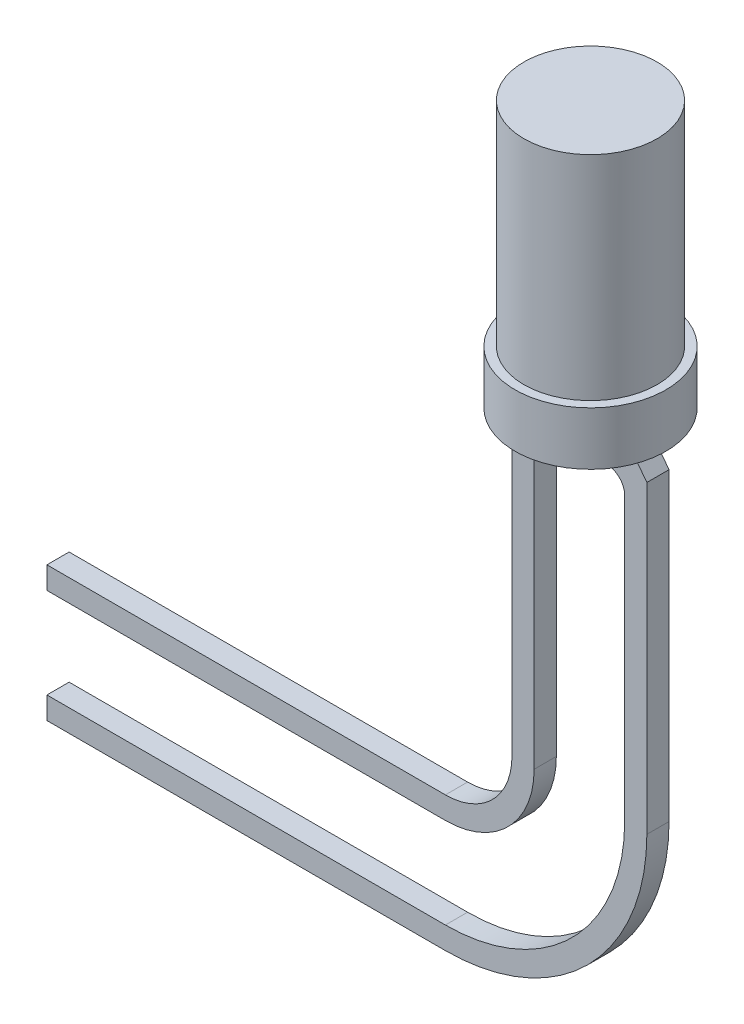
ISO-10303-21;
HEADER;
FILE_DESCRIPTION(('STEP AP214'),'2;1');
FILE_NAME('part.step','',(''),(''),'','','');
FILE_SCHEMA(('AUTOMOTIVE_DESIGN { 1 0 10303 214 1 1 1 1 }'));
ENDSEC;
DATA;
#1=APPLICATION_CONTEXT('core data for automotive mechanical design processes');
#2=APPLICATION_PROTOCOL_DEFINITION('international standard','automotive_design',2000,#1);
#3=PRODUCT_CONTEXT('',#1,'mechanical');
#4=PRODUCT('Part','Part','',(#3));
#5=PRODUCT_RELATED_PRODUCT_CATEGORY('part','',(#4));
#6=PRODUCT_DEFINITION_FORMATION('','',#4);
#7=PRODUCT_DEFINITION_CONTEXT('part definition',#1,'design');
#8=PRODUCT_DEFINITION('design','',#6,#7);
#9=PRODUCT_DEFINITION_SHAPE('','',#8);
#10=(LENGTH_UNIT() NAMED_UNIT(*) SI_UNIT(.MILLI.,.METRE.));
#11=(NAMED_UNIT(*) PLANE_ANGLE_UNIT() SI_UNIT($,.RADIAN.));
#12=(NAMED_UNIT(*) SI_UNIT($,.STERADIAN.) SOLID_ANGLE_UNIT());
#13=UNCERTAINTY_MEASURE_WITH_UNIT(LENGTH_MEASURE(1.E-05),#10,'distance_accuracy_value','');
#14=(GEOMETRIC_REPRESENTATION_CONTEXT(3) GLOBAL_UNCERTAINTY_ASSIGNED_CONTEXT((#13)) GLOBAL_UNIT_ASSIGNED_CONTEXT((#10,
#11,#12)) REPRESENTATION_CONTEXT('',''));
#15=CARTESIAN_POINT('',(0.,0.,0.));
#16=DIRECTION('',(0.,0.,1.));
#17=DIRECTION('',(1.,0.,0.));
#18=AXIS2_PLACEMENT_3D('',#15,#16,#17);
#19=CARTESIAN_POINT('',(0.,-6.,0.));
#20=DIRECTION('',(0.,-1.,0.));
#21=DIRECTION('',(0.,0.,-1.));
#22=AXIS2_PLACEMENT_3D('',#19,#20,#21);
#23=PLANE('',#22);
#24=CARTESIAN_POINT('',(0.,-6.,0.));
#25=DIRECTION('',(0.,-1.,0.));
#26=DIRECTION('',(0.,0.,-1.));
#27=AXIS2_PLACEMENT_3D('',#24,#25,#26);
#28=CIRCLE('',#27,1.7);
#29=CARTESIAN_POINT('',(0.,-6.,-1.7));
#30=VERTEX_POINT('',#29);
#31=EDGE_CURVE('E392',#30,#30,#28,.T.);
#32=ORIENTED_EDGE('',*,*,#31,.T.);
#33=EDGE_LOOP('',(#32));
#34=FACE_BOUND('',#33,.T.);
#35=DIRECTION('',(-1.,0.,0.));
#36=VECTOR('',#35,1.);
#37=CARTESIAN_POINT('',(1.08406668238665,-6.,-0.25));
#38=LINE('',#37,#36);
#39=CARTESIAN_POINT('',(1.08406668238665,-6.,-0.25));
#40=VERTEX_POINT('',#39);
#41=CARTESIAN_POINT('',(0.5,-6.,-0.25));
#42=VERTEX_POINT('',#41);
#43=EDGE_CURVE('E329',#40,#42,#38,.T.);
#44=ORIENTED_EDGE('',*,*,#43,.T.);
#45=DIRECTION('',(0.,0.,1.));
#46=VECTOR('',#45,1.);
#47=CARTESIAN_POINT('',(0.5,-6.,-0.25));
#48=LINE('',#47,#46);
#49=CARTESIAN_POINT('',(0.5,-6.,0.25));
#50=VERTEX_POINT('',#49);
#51=EDGE_CURVE('E365',#42,#50,#48,.T.);
#52=ORIENTED_EDGE('',*,*,#51,.T.);
#53=DIRECTION('',(-1.,0.,0.));
#54=VECTOR('',#53,1.);
#55=CARTESIAN_POINT('',(1.08406668238665,-6.,0.25));
#56=LINE('',#55,#54);
#57=CARTESIAN_POINT('',(1.08406668238665,-6.,0.25));
#58=VERTEX_POINT('',#57);
#59=EDGE_CURVE('E276',#58,#50,#56,.T.);
#60=ORIENTED_EDGE('',*,*,#59,.F.);
#61=DIRECTION('',(0.,0.,1.));
#62=VECTOR('',#61,1.);
#63=CARTESIAN_POINT('',(1.08406668238665,-6.,-0.25));
#64=LINE('',#63,#62);
#65=EDGE_CURVE('E366',#40,#58,#64,.T.);
#66=ORIENTED_EDGE('',*,*,#65,.F.);
#67=EDGE_LOOP('',(#44,#52,#60,#66));
#68=FACE_BOUND('',#67,.T.);
#69=DIRECTION('',(0.,0.,1.));
#70=VECTOR('',#69,1.);
#71=CARTESIAN_POINT('',(-0.5,-6.,-0.25));
#72=LINE('',#71,#70);
#73=CARTESIAN_POINT('',(-0.5,-6.,-0.25));
#74=VERTEX_POINT('',#73);
#75=CARTESIAN_POINT('',(-0.5,-6.,0.25));
#76=VERTEX_POINT('',#75);
#77=EDGE_CURVE('E52',#74,#76,#72,.T.);
#78=ORIENTED_EDGE('',*,*,#77,.F.);
#79=DIRECTION('',(-1.,0.,0.));
#80=VECTOR('',#79,1.);
#81=CARTESIAN_POINT('',(-1.08406668238665,-6.,-0.25));
#82=LINE('',#81,#80);
#83=CARTESIAN_POINT('',(-1.08406668238665,-6.,-0.25));
#84=VERTEX_POINT('',#83);
#85=EDGE_CURVE('E47',#74,#84,#82,.T.);
#86=ORIENTED_EDGE('',*,*,#85,.T.);
#87=DIRECTION('',(0.,0.,1.));
#88=VECTOR('',#87,1.);
#89=CARTESIAN_POINT('',(-1.08406668238665,-6.,-0.25));
#90=LINE('',#89,#88);
#91=CARTESIAN_POINT('',(-1.08406668238665,-6.,0.25));
#92=VERTEX_POINT('',#91);
#93=EDGE_CURVE('E291',#84,#92,#90,.T.);
#94=ORIENTED_EDGE('',*,*,#93,.T.);
#95=DIRECTION('',(-1.,0.,0.));
#96=VECTOR('',#95,1.);
#97=CARTESIAN_POINT('',(-1.08406668238665,-6.,0.25));
#98=LINE('',#97,#96);
#99=EDGE_CURVE('E220',#76,#92,#98,.T.);
#100=ORIENTED_EDGE('',*,*,#99,.F.);
#101=EDGE_LOOP('',(#78,#86,#94,#100));
#102=FACE_BOUND('',#101,.T.);
#103=ADVANCED_FACE('F32',(#34,#68,#102),#23,.T.);
#104=CARTESIAN_POINT('',(0.,-4.8,0.));
#105=DIRECTION('',(0.,1.,0.));
#106=DIRECTION('',(0.,0.,1.));
#107=AXIS2_PLACEMENT_3D('',#104,#105,#106);
#108=CYLINDRICAL_SURFACE('',#107,1.5);
#109=CARTESIAN_POINT('',(0.,-4.8,0.));
#110=DIRECTION('',(0.,-1.,0.));
#111=DIRECTION('',(0.,0.,-1.));
#112=AXIS2_PLACEMENT_3D('',#109,#110,#111);
#113=CIRCLE('',#112,1.5);
#114=CARTESIAN_POINT('',(0.,-4.8,-1.5));
#115=VERTEX_POINT('',#114);
#116=EDGE_CURVE('E40',#115,#115,#113,.F.);
#117=ORIENTED_EDGE('',*,*,#116,.T.);
#118=EDGE_LOOP('',(#117));
#119=FACE_BOUND('',#118,.T.);
#120=CARTESIAN_POINT('',(0.,0.,0.));
#121=DIRECTION('',(0.,1.,0.));
#122=DIRECTION('',(0.,0.,1.));
#123=AXIS2_PLACEMENT_3D('',#120,#121,#122);
#124=CIRCLE('',#123,1.5);
#125=CARTESIAN_POINT('',(0.,0.,1.5));
#126=VERTEX_POINT('',#125);
#127=EDGE_CURVE('E11',#126,#126,#124,.T.);
#128=ORIENTED_EDGE('',*,*,#127,.F.);
#129=EDGE_LOOP('',(#128));
#130=FACE_BOUND('',#129,.T.);
#131=ADVANCED_FACE('F34',(#119,#130),#108,.T.);
#132=CARTESIAN_POINT('',(0.,0.,0.));
#133=DIRECTION('',(0.,1.,0.));
#134=DIRECTION('',(0.,0.,1.));
#135=AXIS2_PLACEMENT_3D('',#132,#133,#134);
#136=PLANE('',#135);
#137=ORIENTED_EDGE('',*,*,#127,.T.);
#138=EDGE_LOOP('',(#137));
#139=FACE_BOUND('',#138,.T.);
#140=ADVANCED_FACE('F410',(#139),#136,.T.);
#141=CARTESIAN_POINT('',(0.,-6.,0.));
#142=DIRECTION('',(0.,1.,0.));
#143=DIRECTION('',(0.,0.,1.));
#144=AXIS2_PLACEMENT_3D('',#141,#142,#143);
#145=CYLINDRICAL_SURFACE('',#144,1.7);
#146=ORIENTED_EDGE('',*,*,#31,.F.);
#147=EDGE_LOOP('',(#146));
#148=FACE_BOUND('',#147,.T.);
#149=CARTESIAN_POINT('',(0.,-4.8,0.));
#150=DIRECTION('',(0.,-1.,0.));
#151=DIRECTION('',(0.,0.,-1.));
#152=AXIS2_PLACEMENT_3D('',#149,#150,#151);
#153=CIRCLE('',#152,1.7);
#154=CARTESIAN_POINT('',(0.,-4.8,-1.7));
#155=VERTEX_POINT('',#154);
#156=EDGE_CURVE('E369',#155,#155,#153,.T.);
#157=ORIENTED_EDGE('',*,*,#156,.T.);
#158=EDGE_LOOP('',(#157));
#159=FACE_BOUND('',#158,.T.);
#160=ADVANCED_FACE('F405',(#148,#159),#145,.T.);
#161=CARTESIAN_POINT('',(0.,-4.8,0.));
#162=DIRECTION('',(0.,-1.,0.));
#163=DIRECTION('',(0.,0.,-1.));
#164=AXIS2_PLACEMENT_3D('',#161,#162,#163);
#165=PLANE('',#164);
#166=ORIENTED_EDGE('',*,*,#116,.F.);
#167=EDGE_LOOP('',(#166));
#168=FACE_BOUND('',#167,.T.);
#169=ORIENTED_EDGE('',*,*,#156,.F.);
#170=EDGE_LOOP('',(#169));
#171=FACE_BOUND('',#170,.T.);
#172=ADVANCED_FACE('F401',(#168,#171),#165,.F.);
#173=CARTESIAN_POINT('',(1.52,-6.57249783833724,-0.25));
#174=DIRECTION('',(0.795602863014056,0.60581852428251,0.));
#175=DIRECTION('',(-0.60581852428251,0.795602863014056,0.));
#176=AXIS2_PLACEMENT_3D('',#173,#174,#175);
#177=PLANE('',#176);
#178=ORIENTED_EDGE('',*,*,#65,.T.);
#179=DIRECTION('',(-0.60581852428251,0.795602863014055,0.));
#180=VECTOR('',#179,1.);
#181=CARTESIAN_POINT('',(1.52,-6.57249783833724,0.25));
#182=LINE('',#181,#180);
#183=CARTESIAN_POINT('',(1.52,-6.57249783833724,0.25));
#184=VERTEX_POINT('',#183);
#185=EDGE_CURVE('E327',#184,#58,#182,.T.);
#186=ORIENTED_EDGE('',*,*,#185,.F.);
#187=DIRECTION('',(0.,0.,1.));
#188=VECTOR('',#187,1.);
#189=CARTESIAN_POINT('',(1.52,-6.57249783833724,-0.25));
#190=LINE('',#189,#188);
#191=CARTESIAN_POINT('',(1.52,-6.57249783833724,-0.25));
#192=VERTEX_POINT('',#191);
#193=EDGE_CURVE('E370',#192,#184,#190,.T.);
#194=ORIENTED_EDGE('',*,*,#193,.F.);
#195=DIRECTION('',(-0.60581852428251,0.795602863014055,0.));
#196=VECTOR('',#195,1.);
#197=CARTESIAN_POINT('',(1.52,-6.57249783833724,-0.25));
#198=LINE('',#197,#196);
#199=EDGE_CURVE('E362',#192,#40,#198,.T.);
#200=ORIENTED_EDGE('',*,*,#199,.T.);
#201=EDGE_LOOP('',(#178,#186,#194,#200));
#202=FACE_BOUND('',#201,.T.);
#203=ADVANCED_FACE('F404',(#202),#177,.T.);
#204=CARTESIAN_POINT('',(1.52,-13.4396370979597,-0.25));
#205=DIRECTION('',(1.,0.,0.));
#206=DIRECTION('',(0.,1.,0.));
#207=AXIS2_PLACEMENT_3D('',#204,#205,#206);
#208=PLANE('',#207);
#209=ORIENTED_EDGE('',*,*,#193,.T.);
#210=DIRECTION('',(0.,1.,0.));
#211=VECTOR('',#210,1.);
#212=CARTESIAN_POINT('',(1.52,-13.4396370979597,0.25));
#213=LINE('',#212,#211);
#214=CARTESIAN_POINT('',(1.52,-13.4396370979597,0.25));
#215=VERTEX_POINT('',#214);
#216=EDGE_CURVE('E324',#215,#184,#213,.T.);
#217=ORIENTED_EDGE('',*,*,#216,.F.);
#218=DIRECTION('',(0.,0.,1.));
#219=VECTOR('',#218,1.);
#220=CARTESIAN_POINT('',(1.52,-13.4396370979597,-0.25));
#221=LINE('',#220,#219);
#222=CARTESIAN_POINT('',(1.52,-13.4396370979597,-0.25));
#223=VERTEX_POINT('',#222);
#224=EDGE_CURVE('E372',#223,#215,#221,.T.);
#225=ORIENTED_EDGE('',*,*,#224,.F.);
#226=DIRECTION('',(0.,1.,0.));
#227=VECTOR('',#226,1.);
#228=CARTESIAN_POINT('',(1.52,-13.4396370979597,-0.25));
#229=LINE('',#228,#227);
#230=EDGE_CURVE('E359',#223,#192,#229,.T.);
#231=ORIENTED_EDGE('',*,*,#230,.T.);
#232=EDGE_LOOP('',(#209,#217,#225,#231));
#233=FACE_BOUND('',#232,.T.);
#234=ADVANCED_FACE('F462',(#233),#208,.T.);
#235=CARTESIAN_POINT('',(-3.02,-13.4396370979597,-0.25));
#236=DIRECTION('',(0.,0.,1.));
#237=DIRECTION('',(1.,0.,0.));
#238=AXIS2_PLACEMENT_3D('',#235,#236,#237);
#239=CYLINDRICAL_SURFACE('',#238,4.54);
#240=ORIENTED_EDGE('',*,*,#224,.T.);
#241=CARTESIAN_POINT('',(-3.02,-13.4396370979597,0.25));
#242=DIRECTION('',(0.,0.,1.));
#243=DIRECTION('',(-1.,0.,0.));
#244=AXIS2_PLACEMENT_3D('',#241,#242,#243);
#245=CIRCLE('',#244,4.54);
#246=CARTESIAN_POINT('',(-3.02,-17.9796370979597,0.25));
#247=VERTEX_POINT('',#246);
#248=EDGE_CURVE('E321',#247,#215,#245,.T.);
#249=ORIENTED_EDGE('',*,*,#248,.F.);
#250=DIRECTION('',(0.,0.,1.));
#251=VECTOR('',#250,1.);
#252=CARTESIAN_POINT('',(-3.02,-17.9796370979597,-0.25));
#253=LINE('',#252,#251);
#254=CARTESIAN_POINT('',(-3.02,-17.9796370979597,-0.25));
#255=VERTEX_POINT('',#254);
#256=EDGE_CURVE('E374',#255,#247,#253,.T.);
#257=ORIENTED_EDGE('',*,*,#256,.F.);
#258=CARTESIAN_POINT('',(-3.02,-13.4396370979597,-0.25));
#259=DIRECTION('',(0.,0.,1.));
#260=DIRECTION('',(-1.,0.,0.));
#261=AXIS2_PLACEMENT_3D('',#258,#259,#260);
#262=CIRCLE('',#261,4.54);
#263=EDGE_CURVE('E356',#255,#223,#262,.T.);
#264=ORIENTED_EDGE('',*,*,#263,.T.);
#265=EDGE_LOOP('',(#240,#249,#257,#264));
#266=FACE_BOUND('',#265,.T.);
#267=ADVANCED_FACE('F458',(#266),#239,.T.);
#268=CARTESIAN_POINT('',(-3.02,-17.9796370979597,-0.25));
#269=DIRECTION('',(0.,-1.,0.));
#270=DIRECTION('',(0.,0.,-1.));
#271=AXIS2_PLACEMENT_3D('',#268,#269,#270);
#272=PLANE('',#271);
#273=ORIENTED_EDGE('',*,*,#256,.T.);
#274=DIRECTION('',(1.,0.,0.));
#275=VECTOR('',#274,1.);
#276=CARTESIAN_POINT('',(-3.02,-17.9796370979597,0.25));
#277=LINE('',#276,#275);
#278=CARTESIAN_POINT('',(-12.,-17.9796370979597,0.25));
#279=VERTEX_POINT('',#278);
#280=EDGE_CURVE('E318',#279,#247,#277,.T.);
#281=ORIENTED_EDGE('',*,*,#280,.F.);
#282=DIRECTION('',(0.,0.,1.));
#283=VECTOR('',#282,1.);
#284=CARTESIAN_POINT('',(-12.,-17.9796370979597,-0.25));
#285=LINE('',#284,#283);
#286=CARTESIAN_POINT('',(-12.,-17.9796370979597,-0.25));
#287=VERTEX_POINT('',#286);
#288=EDGE_CURVE('E376',#287,#279,#285,.T.);
#289=ORIENTED_EDGE('',*,*,#288,.F.);
#290=DIRECTION('',(1.,0.,0.));
#291=VECTOR('',#290,1.);
#292=CARTESIAN_POINT('',(-3.02,-17.9796370979597,-0.25));
#293=LINE('',#292,#291);
#294=EDGE_CURVE('E353',#287,#255,#293,.T.);
#295=ORIENTED_EDGE('',*,*,#294,.T.);
#296=EDGE_LOOP('',(#273,#281,#289,#295));
#297=FACE_BOUND('',#296,.T.);
#298=ADVANCED_FACE('F454',(#297),#272,.T.);
#299=CARTESIAN_POINT('',(-12.,-17.9796370979597,-0.25));
#300=DIRECTION('',(-1.,0.,0.));
#301=DIRECTION('',(0.,0.,1.));
#302=AXIS2_PLACEMENT_3D('',#299,#300,#301);
#303=PLANE('',#302);
#304=ORIENTED_EDGE('',*,*,#288,.T.);
#305=DIRECTION('',(0.,-1.,0.));
#306=VECTOR('',#305,1.);
#307=CARTESIAN_POINT('',(-12.,-17.9796370979597,0.25));
#308=LINE('',#307,#306);
#309=CARTESIAN_POINT('',(-12.,-17.4796370979597,0.25));
#310=VERTEX_POINT('',#309);
#311=EDGE_CURVE('E315',#310,#279,#308,.T.);
#312=ORIENTED_EDGE('',*,*,#311,.F.);
#313=DIRECTION('',(0.,0.,1.));
#314=VECTOR('',#313,1.);
#315=CARTESIAN_POINT('',(-12.,-17.4796370979597,-0.25));
#316=LINE('',#315,#314);
#317=CARTESIAN_POINT('',(-12.,-17.4796370979597,-0.25));
#318=VERTEX_POINT('',#317);
#319=EDGE_CURVE('E378',#318,#310,#316,.T.);
#320=ORIENTED_EDGE('',*,*,#319,.F.);
#321=DIRECTION('',(0.,-1.,0.));
#322=VECTOR('',#321,1.);
#323=CARTESIAN_POINT('',(-12.,-17.9796370979597,-0.25));
#324=LINE('',#323,#322);
#325=EDGE_CURVE('E350',#318,#287,#324,.T.);
#326=ORIENTED_EDGE('',*,*,#325,.T.);
#327=EDGE_LOOP('',(#304,#312,#320,#326));
#328=FACE_BOUND('',#327,.T.);
#329=ADVANCED_FACE('F450',(#328),#303,.T.);
#330=CARTESIAN_POINT('',(-12.,-17.4796370979597,-0.25));
#331=DIRECTION('',(0.,1.,0.));
#332=DIRECTION('',(0.,0.,1.));
#333=AXIS2_PLACEMENT_3D('',#330,#331,#332);
#334=PLANE('',#333);
#335=ORIENTED_EDGE('',*,*,#319,.T.);
#336=DIRECTION('',(-1.,0.,0.));
#337=VECTOR('',#336,1.);
#338=CARTESIAN_POINT('',(-12.,-17.4796370979597,0.25));
#339=LINE('',#338,#337);
#340=CARTESIAN_POINT('',(-3.02,-17.4796370979597,0.25));
#341=VERTEX_POINT('',#340);
#342=EDGE_CURVE('E312',#341,#310,#339,.T.);
#343=ORIENTED_EDGE('',*,*,#342,.F.);
#344=DIRECTION('',(0.,0.,1.));
#345=VECTOR('',#344,1.);
#346=CARTESIAN_POINT('',(-3.02,-17.4796370979597,-0.25));
#347=LINE('',#346,#345);
#348=CARTESIAN_POINT('',(-3.02,-17.4796370979597,-0.25));
#349=VERTEX_POINT('',#348);
#350=EDGE_CURVE('E380',#349,#341,#347,.T.);
#351=ORIENTED_EDGE('',*,*,#350,.F.);
#352=DIRECTION('',(-1.,0.,0.));
#353=VECTOR('',#352,1.);
#354=CARTESIAN_POINT('',(-12.,-17.4796370979597,-0.25));
#355=LINE('',#354,#353);
#356=EDGE_CURVE('E347',#349,#318,#355,.T.);
#357=ORIENTED_EDGE('',*,*,#356,.T.);
#358=EDGE_LOOP('',(#335,#343,#351,#357));
#359=FACE_BOUND('',#358,.T.);
#360=ADVANCED_FACE('F446',(#359),#334,.T.);
#361=CARTESIAN_POINT('',(-3.02,-13.4396370979597,-0.25));
#362=DIRECTION('',(0.,0.,1.));
#363=DIRECTION('',(1.,0.,0.));
#364=AXIS2_PLACEMENT_3D('',#361,#362,#363);
#365=CYLINDRICAL_SURFACE('',#364,4.04);
#366=ORIENTED_EDGE('',*,*,#350,.T.);
#367=CARTESIAN_POINT('',(-3.02,-13.4396370979597,0.25));
#368=DIRECTION('',(0.,0.,-1.));
#369=DIRECTION('',(-1.,0.,0.));
#370=AXIS2_PLACEMENT_3D('',#367,#368,#369);
#371=CIRCLE('',#370,4.04);
#372=CARTESIAN_POINT('',(1.02,-13.4396370979597,0.25));
#373=VERTEX_POINT('',#372);
#374=EDGE_CURVE('E309',#373,#341,#371,.T.);
#375=ORIENTED_EDGE('',*,*,#374,.F.);
#376=DIRECTION('',(0.,0.,1.));
#377=VECTOR('',#376,1.);
#378=CARTESIAN_POINT('',(1.02,-13.4396370979597,-0.25));
#379=LINE('',#378,#377);
#380=CARTESIAN_POINT('',(1.02,-13.4396370979597,-0.25));
#381=VERTEX_POINT('',#380);
#382=EDGE_CURVE('E382',#381,#373,#379,.T.);
#383=ORIENTED_EDGE('',*,*,#382,.F.);
#384=CARTESIAN_POINT('',(-3.02,-13.4396370979597,-0.25));
#385=DIRECTION('',(0.,0.,-1.));
#386=DIRECTION('',(-1.,0.,0.));
#387=AXIS2_PLACEMENT_3D('',#384,#385,#386);
#388=CIRCLE('',#387,4.04);
#389=EDGE_CURVE('E344',#381,#349,#388,.T.);
#390=ORIENTED_EDGE('',*,*,#389,.T.);
#391=EDGE_LOOP('',(#366,#375,#383,#390));
#392=FACE_BOUND('',#391,.T.);
#393=ADVANCED_FACE('F442',(#392),#365,.F.);
#394=CARTESIAN_POINT('',(1.02,-7.07249783833724,-0.25));
#395=DIRECTION('',(-1.,0.,0.));
#396=DIRECTION('',(0.,0.,1.));
#397=AXIS2_PLACEMENT_3D('',#394,#395,#396);
#398=PLANE('',#397);
#399=ORIENTED_EDGE('',*,*,#382,.T.);
#400=DIRECTION('',(0.,-1.,0.));
#401=VECTOR('',#400,1.);
#402=CARTESIAN_POINT('',(1.02,-7.07249783833724,0.25));
#403=LINE('',#402,#401);
#404=CARTESIAN_POINT('',(1.02,-7.07249783833724,0.25));
#405=VERTEX_POINT('',#404);
#406=EDGE_CURVE('E306',#405,#373,#403,.T.);
#407=ORIENTED_EDGE('',*,*,#406,.F.);
#408=DIRECTION('',(0.,0.,1.));
#409=VECTOR('',#408,1.);
#410=CARTESIAN_POINT('',(1.02,-7.07249783833724,-0.25));
#411=LINE('',#410,#409);
#412=CARTESIAN_POINT('',(1.02,-7.07249783833724,-0.25));
#413=VERTEX_POINT('',#412);
#414=EDGE_CURVE('E384',#413,#405,#411,.T.);
#415=ORIENTED_EDGE('',*,*,#414,.F.);
#416=DIRECTION('',(0.,-1.,0.));
#417=VECTOR('',#416,1.);
#418=CARTESIAN_POINT('',(1.02,-7.07249783833724,-0.25));
#419=LINE('',#418,#417);
#420=EDGE_CURVE('E341',#413,#381,#419,.T.);
#421=ORIENTED_EDGE('',*,*,#420,.T.);
#422=EDGE_LOOP('',(#399,#407,#415,#421));
#423=FACE_BOUND('',#422,.T.);
#424=ADVANCED_FACE('F438',(#423),#398,.T.);
#425=CARTESIAN_POINT('',(0.62,-7.07249783833724,-0.25));
#426=DIRECTION('',(0.,0.,1.));
#427=DIRECTION('',(1.,0.,0.));
#428=AXIS2_PLACEMENT_3D('',#425,#426,#427);
#429=CYLINDRICAL_SURFACE('',#428,0.4);
#430=ORIENTED_EDGE('',*,*,#414,.T.);
#431=CARTESIAN_POINT('',(0.62,-7.07249783833724,0.25));
#432=DIRECTION('',(0.,0.,-1.));
#433=DIRECTION('',(-1.,0.,0.));
#434=AXIS2_PLACEMENT_3D('',#431,#432,#433);
#435=CIRCLE('',#434,0.4);
#436=CARTESIAN_POINT('',(0.62,-6.67249783833724,0.25));
#437=VERTEX_POINT('',#436);
#438=EDGE_CURVE('E303',#437,#405,#435,.T.);
#439=ORIENTED_EDGE('',*,*,#438,.F.);
#440=DIRECTION('',(0.,0.,1.));
#441=VECTOR('',#440,1.);
#442=CARTESIAN_POINT('',(0.62,-6.67249783833724,-0.25));
#443=LINE('',#442,#441);
#444=CARTESIAN_POINT('',(0.62,-6.67249783833724,-0.25));
#445=VERTEX_POINT('',#444);
#446=EDGE_CURVE('E386',#445,#437,#443,.T.);
#447=ORIENTED_EDGE('',*,*,#446,.F.);
#448=CARTESIAN_POINT('',(0.62,-7.07249783833724,-0.25));
#449=DIRECTION('',(0.,0.,-1.));
#450=DIRECTION('',(-1.,0.,0.));
#451=AXIS2_PLACEMENT_3D('',#448,#449,#450);
#452=CIRCLE('',#451,0.4);
#453=EDGE_CURVE('E338',#445,#413,#452,.T.);
#454=ORIENTED_EDGE('',*,*,#453,.T.);
#455=EDGE_LOOP('',(#430,#439,#447,#454));
#456=FACE_BOUND('',#455,.T.);
#457=ADVANCED_FACE('F434',(#456),#429,.F.);
#458=CARTESIAN_POINT('',(0.5,-6.67249783833724,-0.25));
#459=DIRECTION('',(0.,-1.,0.));
#460=DIRECTION('',(0.,0.,-1.));
#461=AXIS2_PLACEMENT_3D('',#458,#459,#460);
#462=PLANE('',#461);
#463=ORIENTED_EDGE('',*,*,#446,.T.);
#464=DIRECTION('',(1.,0.,0.));
#465=VECTOR('',#464,1.);
#466=CARTESIAN_POINT('',(0.5,-6.67249783833724,0.25));
#467=LINE('',#466,#465);
#468=CARTESIAN_POINT('',(0.5,-6.67249783833724,0.25));
#469=VERTEX_POINT('',#468);
#470=EDGE_CURVE('E300',#469,#437,#467,.T.);
#471=ORIENTED_EDGE('',*,*,#470,.F.);
#472=DIRECTION('',(0.,0.,1.));
#473=VECTOR('',#472,1.);
#474=CARTESIAN_POINT('',(0.5,-6.67249783833724,-0.25));
#475=LINE('',#474,#473);
#476=CARTESIAN_POINT('',(0.5,-6.67249783833724,-0.25));
#477=VERTEX_POINT('',#476);
#478=EDGE_CURVE('E388',#477,#469,#475,.T.);
#479=ORIENTED_EDGE('',*,*,#478,.F.);
#480=DIRECTION('',(1.,0.,0.));
#481=VECTOR('',#480,1.);
#482=CARTESIAN_POINT('',(0.5,-6.67249783833724,-0.25));
#483=LINE('',#482,#481);
#484=EDGE_CURVE('E335',#477,#445,#483,.T.);
#485=ORIENTED_EDGE('',*,*,#484,.T.);
#486=EDGE_LOOP('',(#463,#471,#479,#485));
#487=FACE_BOUND('',#486,.T.);
#488=ADVANCED_FACE('F430',(#487),#462,.T.);
#489=CARTESIAN_POINT('',(0.5,-6.,-0.25));
#490=DIRECTION('',(-1.,0.,0.));
#491=DIRECTION('',(0.,-1.,0.));
#492=AXIS2_PLACEMENT_3D('',#489,#490,#491);
#493=PLANE('',#492);
#494=ORIENTED_EDGE('',*,*,#478,.T.);
#495=DIRECTION('',(0.,-1.,0.));
#496=VECTOR('',#495,1.);
#497=CARTESIAN_POINT('',(0.5,-6.,0.25));
#498=LINE('',#497,#496);
#499=EDGE_CURVE('E297',#50,#469,#498,.T.);
#500=ORIENTED_EDGE('',*,*,#499,.F.);
#501=ORIENTED_EDGE('',*,*,#51,.F.);
#502=DIRECTION('',(0.,-1.,0.));
#503=VECTOR('',#502,1.);
#504=CARTESIAN_POINT('',(0.5,-6.,-0.25));
#505=LINE('',#504,#503);
#506=EDGE_CURVE('E332',#42,#477,#505,.T.);
#507=ORIENTED_EDGE('',*,*,#506,.T.);
#508=EDGE_LOOP('',(#494,#500,#501,#507));
#509=FACE_BOUND('',#508,.T.);
#510=ADVANCED_FACE('F426',(#509),#493,.T.);
#511=CARTESIAN_POINT('',(0.62,-7.07249783833724,-0.25));
#512=DIRECTION('',(0.,0.,-1.));
#513=DIRECTION('',(-1.,0.,0.));
#514=AXIS2_PLACEMENT_3D('',#511,#512,#513);
#515=PLANE('',#514);
#516=ORIENTED_EDGE('',*,*,#43,.F.);
#517=ORIENTED_EDGE('',*,*,#199,.F.);
#518=ORIENTED_EDGE('',*,*,#230,.F.);
#519=ORIENTED_EDGE('',*,*,#263,.F.);
#520=ORIENTED_EDGE('',*,*,#294,.F.);
#521=ORIENTED_EDGE('',*,*,#325,.F.);
#522=ORIENTED_EDGE('',*,*,#356,.F.);
#523=ORIENTED_EDGE('',*,*,#389,.F.);
#524=ORIENTED_EDGE('',*,*,#420,.F.);
#525=ORIENTED_EDGE('',*,*,#453,.F.);
#526=ORIENTED_EDGE('',*,*,#484,.F.);
#527=ORIENTED_EDGE('',*,*,#506,.F.);
#528=EDGE_LOOP('',(#516,#517,#518,#519,#520,#521,#522,#523,#524,#525,#526,#527));
#529=FACE_BOUND('',#528,.T.);
#530=ADVANCED_FACE('F429',(#529),#515,.T.);
#531=CARTESIAN_POINT('',(0.62,-7.07249783833724,0.25));
#532=DIRECTION('',(0.,0.,-1.));
#533=DIRECTION('',(-1.,0.,0.));
#534=AXIS2_PLACEMENT_3D('',#531,#532,#533);
#535=PLANE('',#534);
#536=ORIENTED_EDGE('',*,*,#59,.T.);
#537=ORIENTED_EDGE('',*,*,#499,.T.);
#538=ORIENTED_EDGE('',*,*,#470,.T.);
#539=ORIENTED_EDGE('',*,*,#438,.T.);
#540=ORIENTED_EDGE('',*,*,#406,.T.);
#541=ORIENTED_EDGE('',*,*,#374,.T.);
#542=ORIENTED_EDGE('',*,*,#342,.T.);
#543=ORIENTED_EDGE('',*,*,#311,.T.);
#544=ORIENTED_EDGE('',*,*,#280,.T.);
#545=ORIENTED_EDGE('',*,*,#248,.T.);
#546=ORIENTED_EDGE('',*,*,#216,.T.);
#547=ORIENTED_EDGE('',*,*,#185,.T.);
#548=EDGE_LOOP('',(#536,#537,#538,#539,#540,#541,#542,#543,#544,#545,#546,#547));
#549=FACE_BOUND('',#548,.T.);
#550=ADVANCED_FACE('F472',(#549),#535,.F.);
#551=CARTESIAN_POINT('',(-0.62,-7.07249783833724,-0.25));
#552=DIRECTION('',(0.,0.,1.));
#553=DIRECTION('',(1.,0.,0.));
#554=AXIS2_PLACEMENT_3D('',#551,#552,#553);
#555=CYLINDRICAL_SURFACE('',#554,0.4);
#556=DIRECTION('',(0.,0.,1.));
#557=VECTOR('',#556,1.);
#558=CARTESIAN_POINT('',(-0.62,-6.67249783833724,-0.25));
#559=LINE('',#558,#557);
#560=CARTESIAN_POINT('',(-0.62,-6.67249783833724,-0.25));
#561=VERTEX_POINT('',#560);
#562=CARTESIAN_POINT('',(-0.62,-6.67249783833724,0.25));
#563=VERTEX_POINT('',#562);
#564=EDGE_CURVE('E191',#561,#563,#559,.T.);
#565=ORIENTED_EDGE('',*,*,#564,.T.);
#566=CARTESIAN_POINT('',(-0.62,-7.07249783833724,0.25));
#567=DIRECTION('',(0.,0.,-1.));
#568=DIRECTION('',(1.,0.,0.));
#569=AXIS2_PLACEMENT_3D('',#566,#567,#568);
#570=CIRCLE('',#569,0.4);
#571=CARTESIAN_POINT('',(-1.02,-7.07249783833724,0.25));
#572=VERTEX_POINT('',#571);
#573=EDGE_CURVE('E195',#572,#563,#570,.T.);
#574=ORIENTED_EDGE('',*,*,#573,.F.);
#575=DIRECTION('',(0.,0.,1.));
#576=VECTOR('',#575,1.);
#577=CARTESIAN_POINT('',(-1.02,-7.07249783833724,-0.25));
#578=LINE('',#577,#576);
#579=CARTESIAN_POINT('',(-1.02,-7.07249783833724,-0.25));
#580=VERTEX_POINT('',#579);
#581=EDGE_CURVE('E274',#580,#572,#578,.T.);
#582=ORIENTED_EDGE('',*,*,#581,.F.);
#583=CARTESIAN_POINT('',(-0.62,-7.07249783833724,-0.25));
#584=DIRECTION('',(0.,0.,-1.));
#585=DIRECTION('',(1.,0.,0.));
#586=AXIS2_PLACEMENT_3D('',#583,#584,#585);
#587=CIRCLE('',#586,0.4);
#588=EDGE_CURVE('E197',#580,#561,#587,.T.);
#589=ORIENTED_EDGE('',*,*,#588,.T.);
#590=EDGE_LOOP('',(#565,#574,#582,#589));
#591=FACE_BOUND('',#590,.T.);
#592=ADVANCED_FACE('F193',(#591),#555,.F.);
#593=CARTESIAN_POINT('',(-1.02,-7.07249783833724,-0.25));
#594=DIRECTION('',(1.,0.,0.));
#595=DIRECTION('',(0.,0.,-1.));
#596=AXIS2_PLACEMENT_3D('',#593,#594,#595);
#597=PLANE('',#596);
#598=ORIENTED_EDGE('',*,*,#581,.T.);
#599=DIRECTION('',(0.,1.,0.));
#600=VECTOR('',#599,1.);
#601=CARTESIAN_POINT('',(-1.02,-7.07249783833724,0.25));
#602=LINE('',#601,#600);
#603=CARTESIAN_POINT('',(-1.02,-13.4396370979597,0.25));
#604=VERTEX_POINT('',#603);
#605=EDGE_CURVE('E216',#604,#572,#602,.T.);
#606=ORIENTED_EDGE('',*,*,#605,.F.);
#607=DIRECTION('',(0.,0.,1.));
#608=VECTOR('',#607,1.);
#609=CARTESIAN_POINT('',(-1.02,-13.4396370979597,-0.25));
#610=LINE('',#609,#608);
#611=CARTESIAN_POINT('',(-1.02,-13.4396370979597,-0.25));
#612=VERTEX_POINT('',#611);
#613=EDGE_CURVE('E277',#612,#604,#610,.T.);
#614=ORIENTED_EDGE('',*,*,#613,.F.);
#615=DIRECTION('',(0.,1.,0.));
#616=VECTOR('',#615,1.);
#617=CARTESIAN_POINT('',(-1.02,-7.07249783833724,-0.25));
#618=LINE('',#617,#616);
#619=EDGE_CURVE('E202',#612,#580,#618,.T.);
#620=ORIENTED_EDGE('',*,*,#619,.T.);
#621=EDGE_LOOP('',(#598,#606,#614,#620));
#622=FACE_BOUND('',#621,.T.);
#623=ADVANCED_FACE('F479',(#622),#597,.T.);
#624=CARTESIAN_POINT('',(-3.02,-13.4396370979597,-0.25));
#625=DIRECTION('',(0.,0.,1.));
#626=DIRECTION('',(1.,0.,0.));
#627=AXIS2_PLACEMENT_3D('',#624,#625,#626);
#628=CYLINDRICAL_SURFACE('',#627,2.);
#629=ORIENTED_EDGE('',*,*,#613,.T.);
#630=CARTESIAN_POINT('',(-3.02,-13.4396370979597,0.25));
#631=DIRECTION('',(0.,0.,1.));
#632=DIRECTION('',(-1.,0.,0.));
#633=AXIS2_PLACEMENT_3D('',#630,#631,#632);
#634=CIRCLE('',#633,2.);
#635=CARTESIAN_POINT('',(-3.02,-15.4396370979597,0.25));
#636=VERTEX_POINT('',#635);
#637=EDGE_CURVE('E241',#636,#604,#634,.T.);
#638=ORIENTED_EDGE('',*,*,#637,.F.);
#639=DIRECTION('',(0.,0.,1.));
#640=VECTOR('',#639,1.);
#641=CARTESIAN_POINT('',(-3.02,-15.4396370979597,-0.25));
#642=LINE('',#641,#640);
#643=CARTESIAN_POINT('',(-3.02,-15.4396370979597,-0.25));
#644=VERTEX_POINT('',#643);
#645=EDGE_CURVE('E279',#644,#636,#642,.T.);
#646=ORIENTED_EDGE('',*,*,#645,.F.);
#647=CARTESIAN_POINT('',(-3.02,-13.4396370979597,-0.25));
#648=DIRECTION('',(0.,0.,1.));
#649=DIRECTION('',(-1.,0.,0.));
#650=AXIS2_PLACEMENT_3D('',#647,#648,#649);
#651=CIRCLE('',#650,2.);
#652=EDGE_CURVE('E269',#644,#612,#651,.T.);
#653=ORIENTED_EDGE('',*,*,#652,.T.);
#654=EDGE_LOOP('',(#629,#638,#646,#653));
#655=FACE_BOUND('',#654,.T.);
#656=ADVANCED_FACE('F510',(#655),#628,.T.);
#657=CARTESIAN_POINT('',(-3.02,-15.4396370979597,-0.25));
#658=DIRECTION('',(0.,-1.,0.));
#659=DIRECTION('',(1.,0.,0.));
#660=AXIS2_PLACEMENT_3D('',#657,#658,#659);
#661=PLANE('',#660);
#662=ORIENTED_EDGE('',*,*,#645,.T.);
#663=DIRECTION('',(1.,0.,0.));
#664=VECTOR('',#663,1.);
#665=CARTESIAN_POINT('',(-3.02,-15.4396370979597,0.25));
#666=LINE('',#665,#664);
#667=CARTESIAN_POINT('',(-12.,-15.4396370979597,0.25));
#668=VERTEX_POINT('',#667);
#669=EDGE_CURVE('E238',#668,#636,#666,.T.);
#670=ORIENTED_EDGE('',*,*,#669,.F.);
#671=DIRECTION('',(0.,0.,1.));
#672=VECTOR('',#671,1.);
#673=CARTESIAN_POINT('',(-12.,-15.4396370979597,-0.25));
#674=LINE('',#673,#672);
#675=CARTESIAN_POINT('',(-12.,-15.4396370979597,-0.25));
#676=VERTEX_POINT('',#675);
#677=EDGE_CURVE('E281',#676,#668,#674,.T.);
#678=ORIENTED_EDGE('',*,*,#677,.F.);
#679=DIRECTION('',(1.,0.,0.));
#680=VECTOR('',#679,1.);
#681=CARTESIAN_POINT('',(-3.02,-15.4396370979597,-0.25));
#682=LINE('',#681,#680);
#683=EDGE_CURVE('E266',#676,#644,#682,.T.);
#684=ORIENTED_EDGE('',*,*,#683,.T.);
#685=EDGE_LOOP('',(#662,#670,#678,#684));
#686=FACE_BOUND('',#685,.T.);
#687=ADVANCED_FACE('F506',(#686),#661,.T.);
#688=CARTESIAN_POINT('',(-12.,-15.4396370979597,-0.25));
#689=DIRECTION('',(-1.,0.,0.));
#690=DIRECTION('',(0.,0.,1.));
#691=AXIS2_PLACEMENT_3D('',#688,#689,#690);
#692=PLANE('',#691);
#693=ORIENTED_EDGE('',*,*,#677,.T.);
#694=DIRECTION('',(0.,-1.,0.));
#695=VECTOR('',#694,1.);
#696=CARTESIAN_POINT('',(-12.,-15.4396370979597,0.25));
#697=LINE('',#696,#695);
#698=CARTESIAN_POINT('',(-12.,-14.9396370979597,0.25));
#699=VERTEX_POINT('',#698);
#700=EDGE_CURVE('E235',#699,#668,#697,.T.);
#701=ORIENTED_EDGE('',*,*,#700,.F.);
#702=DIRECTION('',(0.,0.,1.));
#703=VECTOR('',#702,1.);
#704=CARTESIAN_POINT('',(-12.,-14.9396370979597,-0.25));
#705=LINE('',#704,#703);
#706=CARTESIAN_POINT('',(-12.,-14.9396370979597,-0.25));
#707=VERTEX_POINT('',#706);
#708=EDGE_CURVE('E283',#707,#699,#705,.T.);
#709=ORIENTED_EDGE('',*,*,#708,.F.);
#710=DIRECTION('',(0.,-1.,0.));
#711=VECTOR('',#710,1.);
#712=CARTESIAN_POINT('',(-12.,-15.4396370979597,-0.25));
#713=LINE('',#712,#711);
#714=EDGE_CURVE('E263',#707,#676,#713,.T.);
#715=ORIENTED_EDGE('',*,*,#714,.T.);
#716=EDGE_LOOP('',(#693,#701,#709,#715));
#717=FACE_BOUND('',#716,.T.);
#718=ADVANCED_FACE('F502',(#717),#692,.T.);
#719=CARTESIAN_POINT('',(-12.,-14.9396370979597,-0.25));
#720=DIRECTION('',(0.,1.,0.));
#721=DIRECTION('',(-1.,0.,0.));
#722=AXIS2_PLACEMENT_3D('',#719,#720,#721);
#723=PLANE('',#722);
#724=ORIENTED_EDGE('',*,*,#708,.T.);
#725=DIRECTION('',(-1.,0.,0.));
#726=VECTOR('',#725,1.);
#727=CARTESIAN_POINT('',(-12.,-14.9396370979597,0.25));
#728=LINE('',#727,#726);
#729=CARTESIAN_POINT('',(-3.02,-14.9396370979597,0.25));
#730=VERTEX_POINT('',#729);
#731=EDGE_CURVE('E232',#730,#699,#728,.T.);
#732=ORIENTED_EDGE('',*,*,#731,.F.);
#733=DIRECTION('',(0.,0.,1.));
#734=VECTOR('',#733,1.);
#735=CARTESIAN_POINT('',(-3.02,-14.9396370979597,-0.25));
#736=LINE('',#735,#734);
#737=CARTESIAN_POINT('',(-3.02,-14.9396370979597,-0.25));
#738=VERTEX_POINT('',#737);
#739=EDGE_CURVE('E285',#738,#730,#736,.T.);
#740=ORIENTED_EDGE('',*,*,#739,.F.);
#741=DIRECTION('',(-1.,0.,0.));
#742=VECTOR('',#741,1.);
#743=CARTESIAN_POINT('',(-12.,-14.9396370979597,-0.25));
#744=LINE('',#743,#742);
#745=EDGE_CURVE('E260',#738,#707,#744,.T.);
#746=ORIENTED_EDGE('',*,*,#745,.T.);
#747=EDGE_LOOP('',(#724,#732,#740,#746));
#748=FACE_BOUND('',#747,.T.);
#749=ADVANCED_FACE('F498',(#748),#723,.T.);
#750=CARTESIAN_POINT('',(-3.02,-13.4396370979597,-0.25));
#751=DIRECTION('',(0.,0.,1.));
#752=DIRECTION('',(1.,0.,0.));
#753=AXIS2_PLACEMENT_3D('',#750,#751,#752);
#754=CYLINDRICAL_SURFACE('',#753,1.5);
#755=ORIENTED_EDGE('',*,*,#739,.T.);
#756=CARTESIAN_POINT('',(-3.02,-13.4396370979597,0.25));
#757=DIRECTION('',(0.,0.,-1.));
#758=DIRECTION('',(1.,0.,0.));
#759=AXIS2_PLACEMENT_3D('',#756,#757,#758);
#760=CIRCLE('',#759,1.5);
#761=CARTESIAN_POINT('',(-1.52,-13.4396370979597,0.25));
#762=VERTEX_POINT('',#761);
#763=EDGE_CURVE('E229',#762,#730,#760,.T.);
#764=ORIENTED_EDGE('',*,*,#763,.F.);
#765=DIRECTION('',(0.,0.,1.));
#766=VECTOR('',#765,1.);
#767=CARTESIAN_POINT('',(-1.52,-13.4396370979597,-0.25));
#768=LINE('',#767,#766);
#769=CARTESIAN_POINT('',(-1.52,-13.4396370979597,-0.25));
#770=VERTEX_POINT('',#769);
#771=EDGE_CURVE('E287',#770,#762,#768,.T.);
#772=ORIENTED_EDGE('',*,*,#771,.F.);
#773=CARTESIAN_POINT('',(-3.02,-13.4396370979597,-0.25));
#774=DIRECTION('',(0.,0.,-1.));
#775=DIRECTION('',(1.,0.,0.));
#776=AXIS2_PLACEMENT_3D('',#773,#774,#775);
#777=CIRCLE('',#776,1.5);
#778=EDGE_CURVE('E257',#770,#738,#777,.T.);
#779=ORIENTED_EDGE('',*,*,#778,.T.);
#780=EDGE_LOOP('',(#755,#764,#772,#779));
#781=FACE_BOUND('',#780,.T.);
#782=ADVANCED_FACE('F494',(#781),#754,.F.);
#783=CARTESIAN_POINT('',(-1.52,-13.4396370979597,-0.25));
#784=DIRECTION('',(-1.,0.,0.));
#785=DIRECTION('',(0.,-1.,0.));
#786=AXIS2_PLACEMENT_3D('',#783,#784,#785);
#787=PLANE('',#786);
#788=ORIENTED_EDGE('',*,*,#771,.T.);
#789=DIRECTION('',(0.,-1.,0.));
#790=VECTOR('',#789,1.);
#791=CARTESIAN_POINT('',(-1.52,-13.4396370979597,0.25));
#792=LINE('',#791,#790);
#793=CARTESIAN_POINT('',(-1.52,-6.57249783833724,0.25));
#794=VERTEX_POINT('',#793);
#795=EDGE_CURVE('E226',#794,#762,#792,.T.);
#796=ORIENTED_EDGE('',*,*,#795,.F.);
#797=DIRECTION('',(0.,0.,1.));
#798=VECTOR('',#797,1.);
#799=CARTESIAN_POINT('',(-1.52,-6.57249783833724,-0.25));
#800=LINE('',#799,#798);
#801=CARTESIAN_POINT('',(-1.52,-6.57249783833724,-0.25));
#802=VERTEX_POINT('',#801);
#803=EDGE_CURVE('E289',#802,#794,#800,.T.);
#804=ORIENTED_EDGE('',*,*,#803,.F.);
#805=DIRECTION('',(0.,-1.,0.));
#806=VECTOR('',#805,1.);
#807=CARTESIAN_POINT('',(-1.52,-13.4396370979597,-0.25));
#808=LINE('',#807,#806);
#809=EDGE_CURVE('E254',#802,#770,#808,.T.);
#810=ORIENTED_EDGE('',*,*,#809,.T.);
#811=EDGE_LOOP('',(#788,#796,#804,#810));
#812=FACE_BOUND('',#811,.T.);
#813=ADVANCED_FACE('F490',(#812),#787,.T.);
#814=CARTESIAN_POINT('',(-1.52,-6.57249783833724,-0.25));
#815=DIRECTION('',(-0.795602863014056,0.60581852428251,0.));
#816=DIRECTION('',(-0.60581852428251,-0.795602863014056,0.));
#817=AXIS2_PLACEMENT_3D('',#814,#815,#816);
#818=PLANE('',#817);
#819=ORIENTED_EDGE('',*,*,#803,.T.);
#820=DIRECTION('',(-0.60581852428251,-0.795602863014055,0.));
#821=VECTOR('',#820,1.);
#822=CARTESIAN_POINT('',(-1.52,-6.57249783833724,0.25));
#823=LINE('',#822,#821);
#824=EDGE_CURVE('E223',#92,#794,#823,.T.);
#825=ORIENTED_EDGE('',*,*,#824,.F.);
#826=ORIENTED_EDGE('',*,*,#93,.F.);
#827=DIRECTION('',(-0.60581852428251,-0.795602863014055,0.));
#828=VECTOR('',#827,1.);
#829=CARTESIAN_POINT('',(-1.52,-6.57249783833724,-0.25));
#830=LINE('',#829,#828);
#831=EDGE_CURVE('E251',#84,#802,#830,.T.);
#832=ORIENTED_EDGE('',*,*,#831,.T.);
#833=EDGE_LOOP('',(#819,#825,#826,#832));
#834=FACE_BOUND('',#833,.T.);
#835=ADVANCED_FACE('F486',(#834),#818,.T.);
#836=CARTESIAN_POINT('',(-0.5,-6.,-0.25));
#837=DIRECTION('',(1.,0.,0.));
#838=DIRECTION('',(0.,1.,0.));
#839=AXIS2_PLACEMENT_3D('',#836,#837,#838);
#840=PLANE('',#839);
#841=ORIENTED_EDGE('',*,*,#77,.T.);
#842=DIRECTION('',(0.,1.,0.));
#843=VECTOR('',#842,1.);
#844=CARTESIAN_POINT('',(-0.5,-6.,0.25));
#845=LINE('',#844,#843);
#846=CARTESIAN_POINT('',(-0.5,-6.67249783833724,0.25));
#847=VERTEX_POINT('',#846);
#848=EDGE_CURVE('E210',#847,#76,#845,.T.);
#849=ORIENTED_EDGE('',*,*,#848,.F.);
#850=DIRECTION('',(0.,0.,1.));
#851=VECTOR('',#850,1.);
#852=CARTESIAN_POINT('',(-0.5,-6.67249783833724,-0.25));
#853=LINE('',#852,#851);
#854=CARTESIAN_POINT('',(-0.5,-6.67249783833724,-0.25));
#855=VERTEX_POINT('',#854);
#856=EDGE_CURVE('E201',#855,#847,#853,.T.);
#857=ORIENTED_EDGE('',*,*,#856,.F.);
#858=DIRECTION('',(0.,1.,0.));
#859=VECTOR('',#858,1.);
#860=CARTESIAN_POINT('',(-0.5,-6.,-0.25));
#861=LINE('',#860,#859);
#862=EDGE_CURVE('E247',#855,#74,#861,.T.);
#863=ORIENTED_EDGE('',*,*,#862,.T.);
#864=EDGE_LOOP('',(#841,#849,#857,#863));
#865=FACE_BOUND('',#864,.T.);
#866=ADVANCED_FACE('F483',(#865),#840,.T.);
#867=CARTESIAN_POINT('',(-0.5,-6.67249783833724,-0.25));
#868=DIRECTION('',(0.,-1.,0.));
#869=DIRECTION('',(0.,0.,-1.));
#870=AXIS2_PLACEMENT_3D('',#867,#868,#869);
#871=PLANE('',#870);
#872=ORIENTED_EDGE('',*,*,#856,.T.);
#873=DIRECTION('',(1.,0.,0.));
#874=VECTOR('',#873,1.);
#875=CARTESIAN_POINT('',(-0.5,-6.67249783833724,0.25));
#876=LINE('',#875,#874);
#877=EDGE_CURVE('E205',#563,#847,#876,.T.);
#878=ORIENTED_EDGE('',*,*,#877,.F.);
#879=ORIENTED_EDGE('',*,*,#564,.F.);
#880=DIRECTION('',(1.,0.,0.));
#881=VECTOR('',#880,1.);
#882=CARTESIAN_POINT('',(-0.5,-6.67249783833724,-0.25));
#883=LINE('',#882,#881);
#884=EDGE_CURVE('E245',#561,#855,#883,.T.);
#885=ORIENTED_EDGE('',*,*,#884,.T.);
#886=EDGE_LOOP('',(#872,#878,#879,#885));
#887=FACE_BOUND('',#886,.T.);
#888=ADVANCED_FACE('F206',(#887),#871,.T.);
#889=CARTESIAN_POINT('',(-0.62,-7.07249783833724,-0.25));
#890=DIRECTION('',(0.,0.,1.));
#891=DIRECTION('',(1.,0.,0.));
#892=AXIS2_PLACEMENT_3D('',#889,#890,#891);
#893=PLANE('',#892);
#894=ORIENTED_EDGE('',*,*,#588,.F.);
#895=ORIENTED_EDGE('',*,*,#619,.F.);
#896=ORIENTED_EDGE('',*,*,#652,.F.);
#897=ORIENTED_EDGE('',*,*,#683,.F.);
#898=ORIENTED_EDGE('',*,*,#714,.F.);
#899=ORIENTED_EDGE('',*,*,#745,.F.);
#900=ORIENTED_EDGE('',*,*,#778,.F.);
#901=ORIENTED_EDGE('',*,*,#809,.F.);
#902=ORIENTED_EDGE('',*,*,#831,.F.);
#903=ORIENTED_EDGE('',*,*,#85,.F.);
#904=ORIENTED_EDGE('',*,*,#862,.F.);
#905=ORIENTED_EDGE('',*,*,#884,.F.);
#906=EDGE_LOOP('',(#894,#895,#896,#897,#898,#899,#900,#901,#902,#903,#904,#905));
#907=FACE_BOUND('',#906,.T.);
#908=ADVANCED_FACE('F482',(#907),#893,.F.);
#909=CARTESIAN_POINT('',(-0.62,-7.07249783833724,0.25));
#910=DIRECTION('',(0.,0.,1.));
#911=DIRECTION('',(1.,0.,0.));
#912=AXIS2_PLACEMENT_3D('',#909,#910,#911);
#913=PLANE('',#912);
#914=ORIENTED_EDGE('',*,*,#573,.T.);
#915=ORIENTED_EDGE('',*,*,#877,.T.);
#916=ORIENTED_EDGE('',*,*,#848,.T.);
#917=ORIENTED_EDGE('',*,*,#99,.T.);
#918=ORIENTED_EDGE('',*,*,#824,.T.);
#919=ORIENTED_EDGE('',*,*,#795,.T.);
#920=ORIENTED_EDGE('',*,*,#763,.T.);
#921=ORIENTED_EDGE('',*,*,#731,.T.);
#922=ORIENTED_EDGE('',*,*,#700,.T.);
#923=ORIENTED_EDGE('',*,*,#669,.T.);
#924=ORIENTED_EDGE('',*,*,#637,.T.);
#925=ORIENTED_EDGE('',*,*,#605,.T.);
#926=EDGE_LOOP('',(#914,#915,#916,#917,#918,#919,#920,#921,#922,#923,#924,#925));
#927=FACE_BOUND('',#926,.T.);
#928=ADVANCED_FACE('F213',(#927),#913,.T.);
#929=CLOSED_SHELL('',(#103,#131,#140,#160,#172,#203,#234,#267,#298,#329,#360,#393,#424,#457,
#488,#510,#530,#550,#592,#623,#656,#687,#718,#749,#782,#813,#835,#866,#888,#908,#928));
#930=MANIFOLD_SOLID_BREP('B2',#929);
#931=ADVANCED_BREP_SHAPE_REPRESENTATION('',(#18,#930),#14);
#932=SHAPE_DEFINITION_REPRESENTATION(#9,#931);
ENDSEC;
END-ISO-10303-21;
